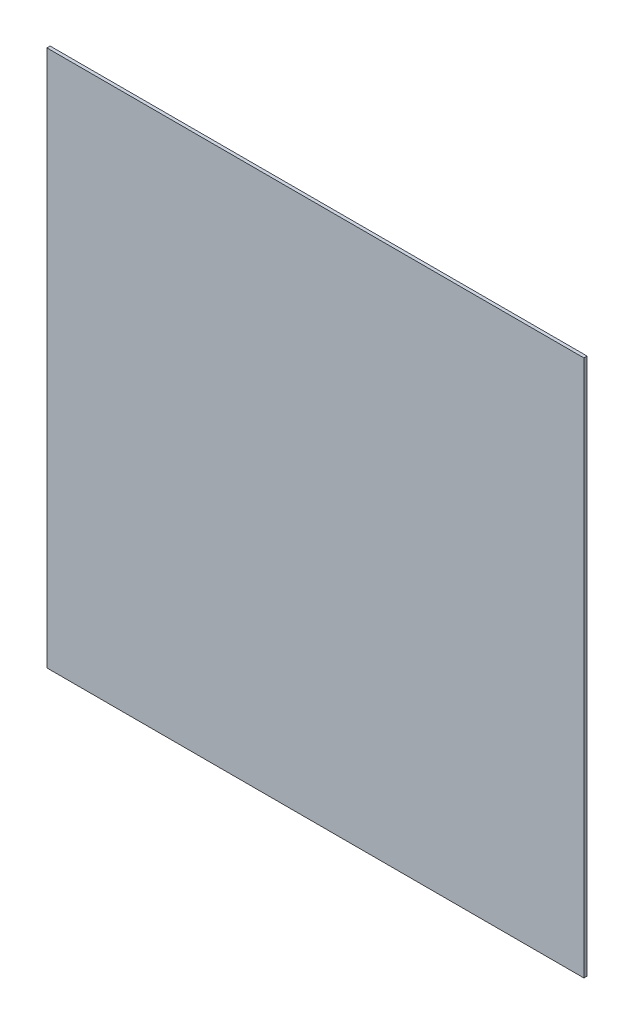
ISO-10303-21;
HEADER;
FILE_DESCRIPTION(('STEP AP214'),'2;1');
FILE_NAME('part.step','',(''),(''),'','','');
FILE_SCHEMA(('AUTOMOTIVE_DESIGN { 1 0 10303 214 1 1 1 1 }'));
ENDSEC;
DATA;
#1=APPLICATION_CONTEXT('core data for automotive mechanical design processes');
#2=APPLICATION_PROTOCOL_DEFINITION('international standard','automotive_design',2000,#1);
#3=PRODUCT_CONTEXT('',#1,'mechanical');
#4=PRODUCT('Part','Part','',(#3));
#5=PRODUCT_RELATED_PRODUCT_CATEGORY('part','',(#4));
#6=PRODUCT_DEFINITION_FORMATION('','',#4);
#7=PRODUCT_DEFINITION_CONTEXT('part definition',#1,'design');
#8=PRODUCT_DEFINITION('design','',#6,#7);
#9=PRODUCT_DEFINITION_SHAPE('','',#8);
#10=(LENGTH_UNIT() NAMED_UNIT(*) SI_UNIT(.MILLI.,.METRE.));
#11=(NAMED_UNIT(*) PLANE_ANGLE_UNIT() SI_UNIT($,.RADIAN.));
#12=(NAMED_UNIT(*) SI_UNIT($,.STERADIAN.) SOLID_ANGLE_UNIT());
#13=UNCERTAINTY_MEASURE_WITH_UNIT(LENGTH_MEASURE(1.E-05),#10,'distance_accuracy_value','');
#14=(GEOMETRIC_REPRESENTATION_CONTEXT(3) GLOBAL_UNCERTAINTY_ASSIGNED_CONTEXT((#13)) GLOBAL_UNIT_ASSIGNED_CONTEXT((#10,
#11,#12)) REPRESENTATION_CONTEXT('',''));
#15=CARTESIAN_POINT('',(0.,0.,0.));
#16=DIRECTION('',(0.,0.,1.));
#17=DIRECTION('',(1.,0.,0.));
#18=AXIS2_PLACEMENT_3D('',#15,#16,#17);
#19=CARTESIAN_POINT('',(250.,-250.,3.));
#20=DIRECTION('',(-1.,0.,0.));
#21=DIRECTION('',(0.,0.,1.));
#22=AXIS2_PLACEMENT_3D('',#19,#20,#21);
#23=PLANE('',#22);
#24=DIRECTION('',(0.,1.,0.));
#25=VECTOR('',#24,1.);
#26=CARTESIAN_POINT('',(250.,-250.,0.));
#27=LINE('',#26,#25);
#28=CARTESIAN_POINT('',(250.,-250.,0.));
#29=VERTEX_POINT('',#28);
#30=CARTESIAN_POINT('',(250.,250.,0.));
#31=VERTEX_POINT('',#30);
#32=EDGE_CURVE('E98',#29,#31,#27,.T.);
#33=ORIENTED_EDGE('',*,*,#32,.T.);
#34=DIRECTION('',(0.,0.,-1.));
#35=VECTOR('',#34,1.);
#36=CARTESIAN_POINT('',(250.,250.,3.));
#37=LINE('',#36,#35);
#38=CARTESIAN_POINT('',(250.,250.,3.));
#39=VERTEX_POINT('',#38);
#40=EDGE_CURVE('E11',#39,#31,#37,.T.);
#41=ORIENTED_EDGE('',*,*,#40,.F.);
#42=DIRECTION('',(0.,1.,0.));
#43=VECTOR('',#42,1.);
#44=CARTESIAN_POINT('',(250.,-250.,3.));
#45=LINE('',#44,#43);
#46=CARTESIAN_POINT('',(250.,-250.,3.));
#47=VERTEX_POINT('',#46);
#48=EDGE_CURVE('E86',#47,#39,#45,.T.);
#49=ORIENTED_EDGE('',*,*,#48,.F.);
#50=DIRECTION('',(0.,0.,-1.));
#51=VECTOR('',#50,1.);
#52=CARTESIAN_POINT('',(250.,-250.,3.));
#53=LINE('',#52,#51);
#54=EDGE_CURVE('E94',#47,#29,#53,.T.);
#55=ORIENTED_EDGE('',*,*,#54,.T.);
#56=EDGE_LOOP('',(#33,#41,#49,#55));
#57=FACE_BOUND('',#56,.T.);
#58=ADVANCED_FACE('F35',(#57),#23,.F.);
#59=CARTESIAN_POINT('',(250.,250.,3.));
#60=DIRECTION('',(0.,-1.,0.));
#61=DIRECTION('',(0.,0.,-1.));
#62=AXIS2_PLACEMENT_3D('',#59,#60,#61);
#63=PLANE('',#62);
#64=DIRECTION('',(-1.,0.,0.));
#65=VECTOR('',#64,1.);
#66=CARTESIAN_POINT('',(250.,250.,0.));
#67=LINE('',#66,#65);
#68=CARTESIAN_POINT('',(-250.,250.,0.));
#69=VERTEX_POINT('',#68);
#70=EDGE_CURVE('E90',#31,#69,#67,.T.);
#71=ORIENTED_EDGE('',*,*,#70,.T.);
#72=DIRECTION('',(0.,0.,-1.));
#73=VECTOR('',#72,1.);
#74=CARTESIAN_POINT('',(-250.,250.,3.));
#75=LINE('',#74,#73);
#76=CARTESIAN_POINT('',(-250.,250.,3.));
#77=VERTEX_POINT('',#76);
#78=EDGE_CURVE('E43',#77,#69,#75,.T.);
#79=ORIENTED_EDGE('',*,*,#78,.F.);
#80=DIRECTION('',(-1.,0.,0.));
#81=VECTOR('',#80,1.);
#82=CARTESIAN_POINT('',(250.,250.,3.));
#83=LINE('',#82,#81);
#84=EDGE_CURVE('E81',#39,#77,#83,.T.);
#85=ORIENTED_EDGE('',*,*,#84,.F.);
#86=ORIENTED_EDGE('',*,*,#40,.T.);
#87=EDGE_LOOP('',(#71,#79,#85,#86));
#88=FACE_BOUND('',#87,.T.);
#89=ADVANCED_FACE('F89',(#88),#63,.F.);
#90=CARTESIAN_POINT('',(-250.,-250.,3.));
#91=DIRECTION('',(1.,0.,0.));
#92=DIRECTION('',(0.,0.,-1.));
#93=AXIS2_PLACEMENT_3D('',#90,#91,#92);
#94=PLANE('',#93);
#95=DIRECTION('',(0.,-1.,0.));
#96=VECTOR('',#95,1.);
#97=CARTESIAN_POINT('',(-250.,-250.,0.));
#98=LINE('',#97,#96);
#99=CARTESIAN_POINT('',(-250.,-250.,0.));
#100=VERTEX_POINT('',#99);
#101=EDGE_CURVE('E68',#69,#100,#98,.T.);
#102=ORIENTED_EDGE('',*,*,#101,.T.);
#103=DIRECTION('',(0.,0.,-1.));
#104=VECTOR('',#103,1.);
#105=CARTESIAN_POINT('',(-250.,-250.,3.));
#106=LINE('',#105,#104);
#107=CARTESIAN_POINT('',(-250.,-250.,3.));
#108=VERTEX_POINT('',#107);
#109=EDGE_CURVE('E91',#108,#100,#106,.T.);
#110=ORIENTED_EDGE('',*,*,#109,.F.);
#111=DIRECTION('',(0.,-1.,0.));
#112=VECTOR('',#111,1.);
#113=CARTESIAN_POINT('',(-250.,-250.,3.));
#114=LINE('',#113,#112);
#115=EDGE_CURVE('E84',#77,#108,#114,.T.);
#116=ORIENTED_EDGE('',*,*,#115,.F.);
#117=ORIENTED_EDGE('',*,*,#78,.T.);
#118=EDGE_LOOP('',(#102,#110,#116,#117));
#119=FACE_BOUND('',#118,.T.);
#120=ADVANCED_FACE('F92',(#119),#94,.F.);
#121=CARTESIAN_POINT('',(250.,-250.,3.));
#122=DIRECTION('',(0.,1.,0.));
#123=DIRECTION('',(0.,0.,1.));
#124=AXIS2_PLACEMENT_3D('',#121,#122,#123);
#125=PLANE('',#124);
#126=DIRECTION('',(1.,0.,0.));
#127=VECTOR('',#126,1.);
#128=CARTESIAN_POINT('',(250.,-250.,0.));
#129=LINE('',#128,#127);
#130=EDGE_CURVE('E74',#100,#29,#129,.T.);
#131=ORIENTED_EDGE('',*,*,#130,.T.);
#132=ORIENTED_EDGE('',*,*,#54,.F.);
#133=DIRECTION('',(1.,0.,0.));
#134=VECTOR('',#133,1.);
#135=CARTESIAN_POINT('',(250.,-250.,3.));
#136=LINE('',#135,#134);
#137=EDGE_CURVE('E51',#108,#47,#136,.T.);
#138=ORIENTED_EDGE('',*,*,#137,.F.);
#139=ORIENTED_EDGE('',*,*,#109,.T.);
#140=EDGE_LOOP('',(#131,#132,#138,#139));
#141=FACE_BOUND('',#140,.T.);
#142=ADVANCED_FACE('F105',(#141),#125,.F.);
#143=CARTESIAN_POINT('',(0.,0.,3.));
#144=DIRECTION('',(0.,0.,1.));
#145=DIRECTION('',(1.,0.,0.));
#146=AXIS2_PLACEMENT_3D('',#143,#144,#145);
#147=PLANE('',#146);
#148=ORIENTED_EDGE('',*,*,#48,.T.);
#149=ORIENTED_EDGE('',*,*,#84,.T.);
#150=ORIENTED_EDGE('',*,*,#115,.T.);
#151=ORIENTED_EDGE('',*,*,#137,.T.);
#152=EDGE_LOOP('',(#148,#149,#150,#151));
#153=FACE_BOUND('',#152,.T.);
#154=ADVANCED_FACE('F82',(#153),#147,.T.);
#155=CARTESIAN_POINT('',(0.,0.,0.));
#156=DIRECTION('',(0.,0.,1.));
#157=DIRECTION('',(1.,0.,0.));
#158=AXIS2_PLACEMENT_3D('',#155,#156,#157);
#159=PLANE('',#158);
#160=ORIENTED_EDGE('',*,*,#32,.F.);
#161=ORIENTED_EDGE('',*,*,#130,.F.);
#162=ORIENTED_EDGE('',*,*,#101,.F.);
#163=ORIENTED_EDGE('',*,*,#70,.F.);
#164=EDGE_LOOP('',(#160,#161,#162,#163));
#165=FACE_BOUND('',#164,.T.);
#166=ADVANCED_FACE('F108',(#165),#159,.F.);
#167=CLOSED_SHELL('',(#58,#89,#120,#142,#154,#166));
#168=MANIFOLD_SOLID_BREP('B2',#167);
#169=ADVANCED_BREP_SHAPE_REPRESENTATION('',(#18,#168),#14);
#170=SHAPE_DEFINITION_REPRESENTATION(#9,#169);
ENDSEC;
END-ISO-10303-21;
